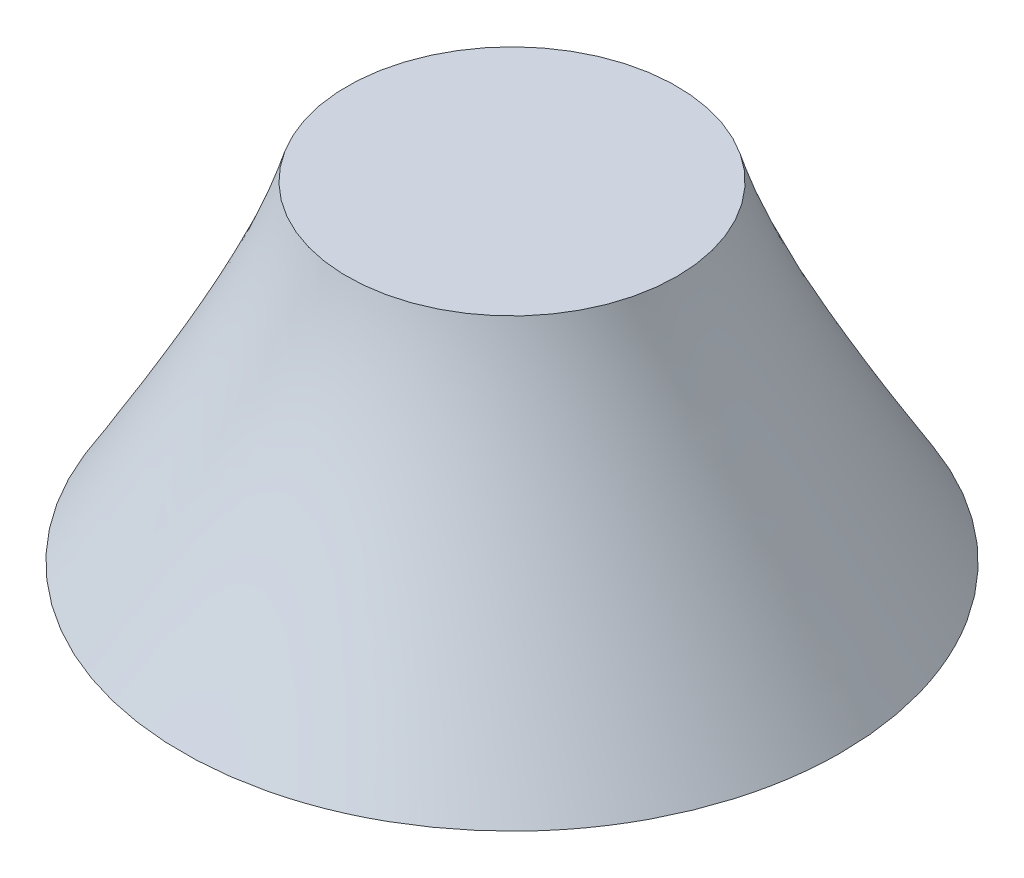
ISO-10303-21;
HEADER;
FILE_DESCRIPTION(('STEP AP214'),'2;1');
FILE_NAME('part.step','',(''),(''),'','','');
FILE_SCHEMA(('AUTOMOTIVE_DESIGN { 1 0 10303 214 1 1 1 1 }'));
ENDSEC;
DATA;
#1=APPLICATION_CONTEXT('core data for automotive mechanical design processes');
#2=APPLICATION_PROTOCOL_DEFINITION('international standard','automotive_design',2000,#1);
#3=PRODUCT_CONTEXT('',#1,'mechanical');
#4=PRODUCT('Part','Part','',(#3));
#5=PRODUCT_RELATED_PRODUCT_CATEGORY('part','',(#4));
#6=PRODUCT_DEFINITION_FORMATION('','',#4);
#7=PRODUCT_DEFINITION_CONTEXT('part definition',#1,'design');
#8=PRODUCT_DEFINITION('design','',#6,#7);
#9=PRODUCT_DEFINITION_SHAPE('','',#8);
#10=(LENGTH_UNIT() NAMED_UNIT(*) SI_UNIT(.MILLI.,.METRE.));
#11=(NAMED_UNIT(*) PLANE_ANGLE_UNIT() SI_UNIT($,.RADIAN.));
#12=(NAMED_UNIT(*) SI_UNIT($,.STERADIAN.) SOLID_ANGLE_UNIT());
#13=UNCERTAINTY_MEASURE_WITH_UNIT(LENGTH_MEASURE(1.E-05),#10,'distance_accuracy_value','');
#14=(GEOMETRIC_REPRESENTATION_CONTEXT(3) GLOBAL_UNCERTAINTY_ASSIGNED_CONTEXT((#13)) GLOBAL_UNIT_ASSIGNED_CONTEXT((#10,
#11,#12)) REPRESENTATION_CONTEXT('',''));
#15=CARTESIAN_POINT('',(0.,0.,0.));
#16=DIRECTION('',(0.,0.,1.));
#17=DIRECTION('',(1.,0.,0.));
#18=AXIS2_PLACEMENT_3D('',#15,#16,#17);
#19=CARTESIAN_POINT('',(0.,0.,0.));
#20=DIRECTION('',(0.,1.,0.));
#21=DIRECTION('',(0.,0.,1.));
#22=AXIS2_PLACEMENT_3D('',#19,#20,#21);
#23=PLANE('',#22);
#24=CARTESIAN_POINT('',(0.,0.,0.));
#25=DIRECTION('',(0.,1.,0.));
#26=DIRECTION('',(0.,0.,1.));
#27=AXIS2_PLACEMENT_3D('',#24,#25,#26);
#28=CIRCLE('',#27,10.);
#29=CARTESIAN_POINT('',(-9.26265751019066,0.,-3.76871010412164));
#30=VERTEX_POINT('',#29);
#31=EDGE_CURVE('E11',#30,#30,#28,.T.);
#32=ORIENTED_EDGE('',*,*,#31,.F.);
#33=EDGE_LOOP('',(#32));
#34=FACE_BOUND('',#33,.T.);
#35=ADVANCED_FACE('F40',(#34),#23,.F.);
#36=CARTESIAN_POINT('',(0.,10.,0.));
#37=DIRECTION('',(0.,1.,0.));
#38=DIRECTION('',(0.,0.,1.));
#39=AXIS2_PLACEMENT_3D('',#36,#37,#38);
#40=PLANE('',#39);
#41=CARTESIAN_POINT('',(0.,10.,0.));
#42=DIRECTION('',(0.,1.,0.));
#43=DIRECTION('',(0.,0.,1.));
#44=AXIS2_PLACEMENT_3D('',#41,#42,#43);
#45=CIRCLE('',#44,5.);
#46=CARTESIAN_POINT('',(-2.51268583046156,10.,-4.32277803239973));
#47=VERTEX_POINT('',#46);
#48=EDGE_CURVE('E48',#47,#47,#45,.T.);
#49=ORIENTED_EDGE('',*,*,#48,.T.);
#50=EDGE_LOOP('',(#49));
#51=FACE_BOUND('',#50,.T.);
#52=ADVANCED_FACE('F72',(#51),#40,.T.);
#53=CARTESIAN_POINT('',(-2.51268583046156,10.,-4.32277803239973));
#54=CARTESIAN_POINT('',(-9.26265751019066,0.,-3.76871010412164));
#55=CARTESIAN_POINT('',(6.1328702343379,10.,-9.34814969332285));
#56=CARTESIAN_POINT('',(-1.72523730194739,0.,-22.294025124503));
#57=CARTESIAN_POINT('',(11.158241895261,10.,-0.702593628523391));
#58=CARTESIAN_POINT('',(16.8000777184339,0.,-14.7566049162597));
#59=CARTESIAN_POINT('',(2.51268583046156,10.,4.32277803239973));
#60=CARTESIAN_POINT('',(9.26265751019066,0.,3.76871010412164));
#61=CARTESIAN_POINT('',(-6.1328702343379,10.,9.34814969332285));
#62=CARTESIAN_POINT('',(1.7252373019474,0.,22.2940251245029));
#63=CARTESIAN_POINT('',(-11.158241895261,10.,0.702593628523393));
#64=CARTESIAN_POINT('',(-16.8000777184339,0.,14.7566049162597));
#65=CARTESIAN_POINT('',(-2.51268583046156,10.,-4.32277803239973));
#66=CARTESIAN_POINT('',(-9.26265751019066,0.,-3.76871010412164));
#67=(BOUNDED_SURFACE() B_SPLINE_SURFACE(3,1,((#53,#54),(#55,#56),(#57,#58),(#59,#60),(#61,#62),
(#63,#64),(#65,#66)),.UNSPECIFIED.,.T.,.F.,.F.) B_SPLINE_SURFACE_WITH_KNOTS((4,3,4),(2,2),(0.,
0.5,1.),(0.,1.),.UNSPECIFIED.) GEOMETRIC_REPRESENTATION_ITEM() RATIONAL_B_SPLINE_SURFACE(((1.,
1.),(0.333333333333333,0.333333333333333),(0.333333333333333,0.333333333333333),(1.,1.),
(0.333333333333334,0.333333333333334),(0.333333333333334,0.333333333333334),(1.,1.))) REPRESENTATION_ITEM('') SURFACE());
#68=CARTESIAN_POINT('',(-2.51268583046156,10.,-4.32277803239973));
#69=CARTESIAN_POINT('',(-2.58299803545874,9.89583333333333,-4.31700649148017));
#70=CARTESIAN_POINT('',(-2.65331024045592,9.79166666666667,-4.31123495056061));
#71=CARTESIAN_POINT('',(-2.79393465045027,9.58333333333333,-4.29969186872148));
#72=CARTESIAN_POINT('',(-2.86424685544745,9.47916666666667,-4.29392032780191));
#73=CARTESIAN_POINT('',(-3.00487126544181,9.27083333333333,-4.28237724596279));
#74=CARTESIAN_POINT('',(-3.07518347043899,9.16666666666667,-4.27660570504322));
#75=CARTESIAN_POINT('',(-3.21580788043334,8.95833333333333,-4.2650626232041));
#76=CARTESIAN_POINT('',(-3.28612008543052,8.85416666666667,-4.25929108228453));
#77=CARTESIAN_POINT('',(-3.42674449542488,8.64583333333333,-4.24774800044541));
#78=CARTESIAN_POINT('',(-3.49705670042206,8.54166666666667,-4.24197645952584));
#79=CARTESIAN_POINT('',(-3.63768111041641,8.33333333333333,-4.23043337768672));
#80=CARTESIAN_POINT('',(-3.70799331541359,8.22916666666667,-4.22466183676715));
#81=CARTESIAN_POINT('',(-3.84861772540795,8.02083333333333,-4.21311875492803));
#82=CARTESIAN_POINT('',(-3.91892993040512,7.91666666666667,-4.20734721400846));
#83=CARTESIAN_POINT('',(-4.05955434039948,7.70833333333333,-4.19580413216933));
#84=CARTESIAN_POINT('',(-4.12986654539666,7.60416666666667,-4.19003259124977));
#85=CARTESIAN_POINT('',(-4.27049095539102,7.39583333333333,-4.17848950941064));
#86=CARTESIAN_POINT('',(-4.34080316038819,7.29166666666667,-4.17271796849108));
#87=CARTESIAN_POINT('',(-4.48142757038255,7.08333333333333,-4.16117488665195));
#88=CARTESIAN_POINT('',(-4.55173977537973,6.97916666666667,-4.15540334573239));
#89=CARTESIAN_POINT('',(-4.69236418537408,6.77083333333333,-4.14386026389326));
#90=CARTESIAN_POINT('',(-4.76267639037126,6.66666666666667,-4.1380887229737));
#91=CARTESIAN_POINT('',(-4.90330080036562,6.45833333333333,-4.12654564113457));
#92=CARTESIAN_POINT('',(-4.9736130053628,6.35416666666667,-4.12077410021501));
#93=CARTESIAN_POINT('',(-5.11423741535715,6.14583333333333,-4.10923101837588));
#94=CARTESIAN_POINT('',(-5.18454962035433,6.04166666666667,-4.10345947745632));
#95=CARTESIAN_POINT('',(-5.32517403034869,5.83333333333333,-4.09191639561719));
#96=CARTESIAN_POINT('',(-5.39548623534587,5.72916666666667,-4.08614485469763));
#97=CARTESIAN_POINT('',(-5.53611064534022,5.52083333333333,-4.0746017728585));
#98=CARTESIAN_POINT('',(-5.6064228503374,5.41666666666667,-4.06883023193894));
#99=CARTESIAN_POINT('',(-5.74704726033176,5.20833333333333,-4.05728715009981));
#100=CARTESIAN_POINT('',(-5.81735946532893,5.10416666666667,-4.05151560918025));
#101=CARTESIAN_POINT('',(-5.95798387532329,4.89583333333333,-4.03997252734112));
#102=CARTESIAN_POINT('',(-6.02829608032047,4.79166666666667,-4.03420098642156));
#103=CARTESIAN_POINT('',(-6.16892049031483,4.58333333333333,-4.02265790458243));
#104=CARTESIAN_POINT('',(-6.239232695312,4.47916666666667,-4.01688636366287));
#105=CARTESIAN_POINT('',(-6.37985710530636,4.27083333333333,-4.00534328182374));
#106=CARTESIAN_POINT('',(-6.45016931030354,4.16666666666667,-3.99957174090418));
#107=CARTESIAN_POINT('',(-6.5907937202979,3.95833333333333,-3.98802865906505));
#108=CARTESIAN_POINT('',(-6.66110592529507,3.85416666666667,-3.98225711814549));
#109=CARTESIAN_POINT('',(-6.80173033528943,3.64583333333333,-3.97071403630636));
#110=CARTESIAN_POINT('',(-6.87204254028661,3.54166666666667,-3.96494249538679));
#111=CARTESIAN_POINT('',(-7.01266695028096,3.33333333333333,-3.95339941354767));
#112=CARTESIAN_POINT('',(-7.08297915527814,3.22916666666667,-3.9476278726281));
#113=CARTESIAN_POINT('',(-7.2236035652725,3.02083333333333,-3.93608479078898));
#114=CARTESIAN_POINT('',(-7.29391577026968,2.91666666666667,-3.93031324986941));
#115=CARTESIAN_POINT('',(-7.43454018026403,2.70833333333333,-3.91877016803029));
#116=CARTESIAN_POINT('',(-7.50485238526121,2.60416666666667,-3.91299862711072));
#117=CARTESIAN_POINT('',(-7.64547679525557,2.39583333333333,-3.9014555452716));
#118=CARTESIAN_POINT('',(-7.71578900025275,2.29166666666667,-3.89568400435203));
#119=CARTESIAN_POINT('',(-7.8564134102471,2.08333333333333,-3.88414092251291));
#120=CARTESIAN_POINT('',(-7.92672561524428,1.97916666666667,-3.87836938159334));
#121=CARTESIAN_POINT('',(-8.06735002523864,1.77083333333333,-3.86682629975422));
#122=CARTESIAN_POINT('',(-8.13766223023581,1.66666666666667,-3.86105475883465));
#123=CARTESIAN_POINT('',(-8.27828664023017,1.45833333333333,-3.84951167699553));
#124=CARTESIAN_POINT('',(-8.34859884522735,1.35416666666667,-3.84374013607596));
#125=CARTESIAN_POINT('',(-8.48922325522171,1.14583333333333,-3.83219705423683));
#126=CARTESIAN_POINT('',(-8.55953546021888,1.04166666666667,-3.82642551331727));
#127=CARTESIAN_POINT('',(-8.70015987021324,0.833333333333333,-3.81488243147814));
#128=CARTESIAN_POINT('',(-8.77047207521042,0.729166666666667,-3.80911089055858));
#129=CARTESIAN_POINT('',(-8.91109648520477,0.520833333333333,-3.79756780871945));
#130=CARTESIAN_POINT('',(-8.98140869020195,0.416666666666666,-3.79179626779989));
#131=CARTESIAN_POINT('',(-9.12203310019631,0.208333333333334,-3.78025318596076));
#132=CARTESIAN_POINT('',(-9.19234530519349,0.104166666666667,-3.7744816450412));
#133=CARTESIAN_POINT('',(-9.26265751019066,0.,-3.76871010412164));
#134=B_SPLINE_CURVE_WITH_KNOTS('',3,(#68,#69,#70,#71,#72,#73,#74,#75,#76,#77,#78,#79,#80,#81,
#82,#83,#84,#85,#86,#87,#88,#89,#90,#91,#92,#93,#94,#95,#96,#97,#98,#99,#100,#101,#102,#103,
#104,#105,#106,#107,#108,#109,#110,#111,#112,#113,#114,#115,#116,#117,#118,#119,#120,#121,#122,
#123,#124,#125,#126,#127,#128,#129,#130,#131,#132,#133),.UNSPECIFIED.,.F.,.F.,(4,2,2,2,2,2,2,2,
2,2,2,2,2,2,2,2,2,2,2,2,2,2,2,2,2,2,2,2,2,2,2,2,4),(0.,0.377425889023743,0.754851778047486,
1.13227766707123,1.50970355609497,1.88712944511871,2.26455533414246,2.6419812231662,
3.01940711218994,3.39683300121368,3.77425889023743,4.15168477926117,4.52911066828491,
4.90653655730866,5.2839624463324,5.66138833535614,6.03881422437988,6.41624011340363,
6.79366600242737,7.17109189145111,7.54851778047485,7.9259436694986,8.30336955852234,
8.68079544754608,9.05822133656982,9.43564722559357,9.81307311461731,10.1904990036411,
10.5679248926648,10.9453507816885,11.3227766707123,11.700202559736,12.0776284487598),.UNSPECIFIED.);
#135=EDGE_CURVE('BSEAM80',#47,#30,#134,.T.);
#136=ORIENTED_EDGE('',*,*,#48,.F.);
#137=ORIENTED_EDGE('',*,*,#31,.T.);
#138=ORIENTED_EDGE('',*,*,#135,.T.);
#139=ORIENTED_EDGE('',*,*,#135,.F.);
#140=EDGE_LOOP('',(#136,#138,#137,#139));
#141=FACE_BOUND('',#140,.T.);
#142=ADVANCED_FACE('F80',(#141),#67,.T.);
#143=CLOSED_SHELL('',(#35,#52,#142));
#144=MANIFOLD_SOLID_BREP('B2',#143);
#145=ADVANCED_BREP_SHAPE_REPRESENTATION('',(#18,#144),#14);
#146=SHAPE_DEFINITION_REPRESENTATION(#9,#145);
ENDSEC;
END-ISO-10303-21;
